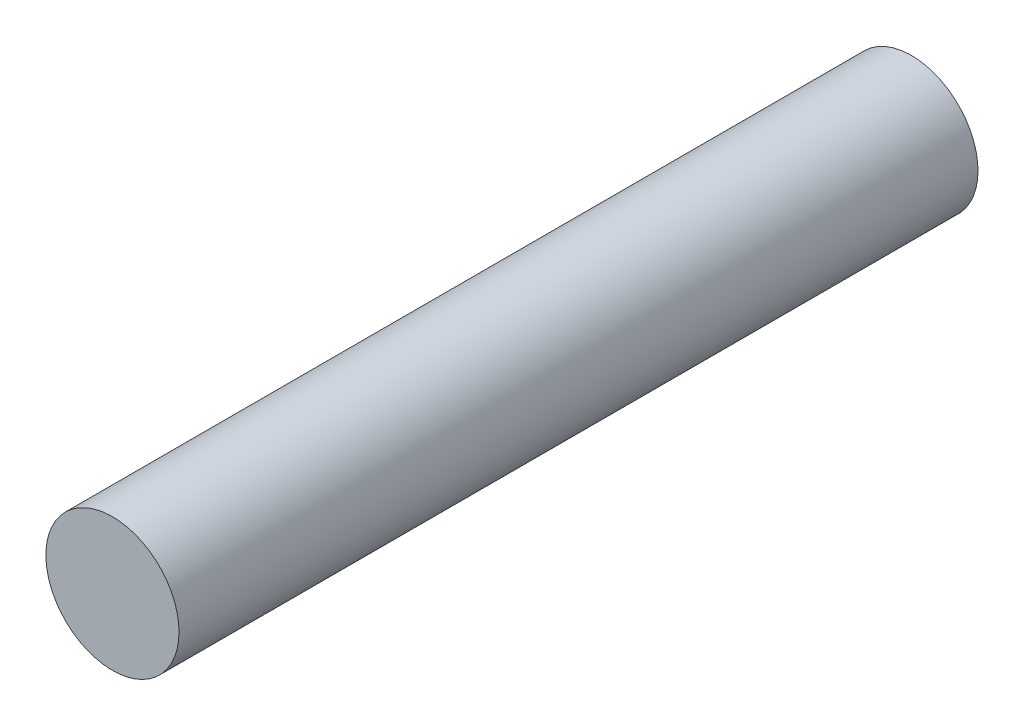
ISO-10303-21;
HEADER;
FILE_DESCRIPTION(('STEP AP214'),'2;1');
FILE_NAME('part.step','',(''),(''),'','','');
FILE_SCHEMA(('AUTOMOTIVE_DESIGN { 1 0 10303 214 1 1 1 1 }'));
ENDSEC;
DATA;
#1=APPLICATION_CONTEXT('core data for automotive mechanical design processes');
#2=APPLICATION_PROTOCOL_DEFINITION('international standard','automotive_design',2000,#1);
#3=PRODUCT_CONTEXT('',#1,'mechanical');
#4=PRODUCT('Part','Part','',(#3));
#5=PRODUCT_RELATED_PRODUCT_CATEGORY('part','',(#4));
#6=PRODUCT_DEFINITION_FORMATION('','',#4);
#7=PRODUCT_DEFINITION_CONTEXT('part definition',#1,'design');
#8=PRODUCT_DEFINITION('design','',#6,#7);
#9=PRODUCT_DEFINITION_SHAPE('','',#8);
#10=(LENGTH_UNIT() NAMED_UNIT(*) SI_UNIT(.MILLI.,.METRE.));
#11=(NAMED_UNIT(*) PLANE_ANGLE_UNIT() SI_UNIT($,.RADIAN.));
#12=(NAMED_UNIT(*) SI_UNIT($,.STERADIAN.) SOLID_ANGLE_UNIT());
#13=UNCERTAINTY_MEASURE_WITH_UNIT(LENGTH_MEASURE(1.E-05),#10,'distance_accuracy_value','');
#14=(GEOMETRIC_REPRESENTATION_CONTEXT(3) GLOBAL_UNCERTAINTY_ASSIGNED_CONTEXT((#13)) GLOBAL_UNIT_ASSIGNED_CONTEXT((#10,
#11,#12)) REPRESENTATION_CONTEXT('',''));
#15=CARTESIAN_POINT('',(0.,0.,0.));
#16=DIRECTION('',(0.,0.,1.));
#17=DIRECTION('',(1.,0.,0.));
#18=AXIS2_PLACEMENT_3D('',#15,#16,#17);
#19=CARTESIAN_POINT('',(0.,0.,12.));
#20=DIRECTION('',(0.,0.,-1.));
#21=DIRECTION('',(-1.,0.,0.));
#22=AXIS2_PLACEMENT_3D('',#19,#20,#21);
#23=CYLINDRICAL_SURFACE('',#22,1.);
#24=CARTESIAN_POINT('',(0.,0.,12.));
#25=DIRECTION('',(0.,0.,1.));
#26=DIRECTION('',(1.,0.,0.));
#27=AXIS2_PLACEMENT_3D('',#24,#25,#26);
#28=CIRCLE('',#27,1.);
#29=CARTESIAN_POINT('',(1.,0.,12.));
#30=VERTEX_POINT('',#29);
#31=EDGE_CURVE('E10',#30,#30,#28,.T.);
#32=ORIENTED_EDGE('',*,*,#31,.F.);
#33=EDGE_LOOP('',(#32));
#34=FACE_BOUND('',#33,.T.);
#35=CARTESIAN_POINT('',(0.,0.,0.));
#36=DIRECTION('',(0.,0.,1.));
#37=DIRECTION('',(1.,0.,0.));
#38=AXIS2_PLACEMENT_3D('',#35,#36,#37);
#39=CIRCLE('',#38,1.);
#40=CARTESIAN_POINT('',(1.,0.,0.));
#41=VERTEX_POINT('',#40);
#42=EDGE_CURVE('E40',#41,#41,#39,.T.);
#43=ORIENTED_EDGE('',*,*,#42,.T.);
#44=EDGE_LOOP('',(#43));
#45=FACE_BOUND('',#44,.T.);
#46=ADVANCED_FACE('F37',(#34,#45),#23,.T.);
#47=CARTESIAN_POINT('',(0.,0.,12.));
#48=DIRECTION('',(0.,0.,1.));
#49=DIRECTION('',(1.,0.,0.));
#50=AXIS2_PLACEMENT_3D('',#47,#48,#49);
#51=PLANE('',#50);
#52=ORIENTED_EDGE('',*,*,#31,.T.);
#53=EDGE_LOOP('',(#52));
#54=FACE_BOUND('',#53,.T.);
#55=ADVANCED_FACE('F52',(#54),#51,.T.);
#56=CARTESIAN_POINT('',(0.,0.,0.));
#57=DIRECTION('',(0.,0.,1.));
#58=DIRECTION('',(1.,0.,0.));
#59=AXIS2_PLACEMENT_3D('',#56,#57,#58);
#60=PLANE('',#59);
#61=ORIENTED_EDGE('',*,*,#42,.F.);
#62=EDGE_LOOP('',(#61));
#63=FACE_BOUND('',#62,.T.);
#64=ADVANCED_FACE('F50',(#63),#60,.F.);
#65=CLOSED_SHELL('',(#46,#55,#64));
#66=MANIFOLD_SOLID_BREP('B2',#65);
#67=ADVANCED_BREP_SHAPE_REPRESENTATION('',(#18,#66),#14);
#68=SHAPE_DEFINITION_REPRESENTATION(#9,#67);
ENDSEC;
END-ISO-10303-21;
